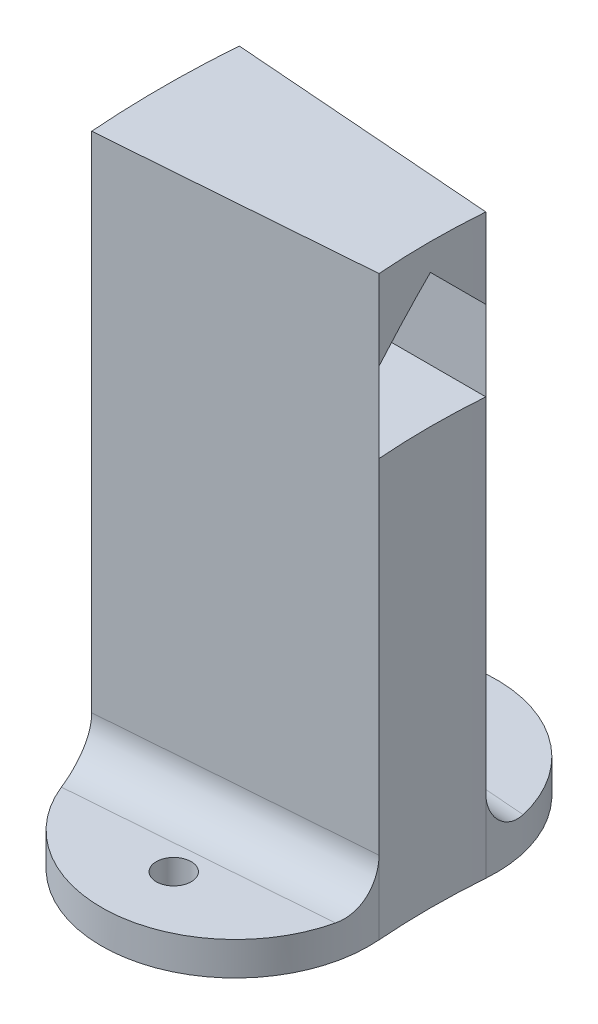
ISO-10303-21;
HEADER;
FILE_DESCRIPTION(('STEP AP214'),'2;1');
FILE_NAME('part.step','',(''),(''),'','','');
FILE_SCHEMA(('AUTOMOTIVE_DESIGN { 1 0 10303 214 1 1 1 1 }'));
ENDSEC;
DATA;
#1=APPLICATION_CONTEXT('core data for automotive mechanical design processes');
#2=APPLICATION_PROTOCOL_DEFINITION('international standard','automotive_design',2000,#1);
#3=PRODUCT_CONTEXT('',#1,'mechanical');
#4=PRODUCT('Part','Part','',(#3));
#5=PRODUCT_RELATED_PRODUCT_CATEGORY('part','',(#4));
#6=PRODUCT_DEFINITION_FORMATION('','',#4);
#7=PRODUCT_DEFINITION_CONTEXT('part definition',#1,'design');
#8=PRODUCT_DEFINITION('design','',#6,#7);
#9=PRODUCT_DEFINITION_SHAPE('','',#8);
#10=(LENGTH_UNIT() NAMED_UNIT(*) SI_UNIT(.MILLI.,.METRE.));
#11=(NAMED_UNIT(*) PLANE_ANGLE_UNIT() SI_UNIT($,.RADIAN.));
#12=(NAMED_UNIT(*) SI_UNIT($,.STERADIAN.) SOLID_ANGLE_UNIT());
#13=UNCERTAINTY_MEASURE_WITH_UNIT(LENGTH_MEASURE(1.E-05),#10,'distance_accuracy_value','');
#14=(GEOMETRIC_REPRESENTATION_CONTEXT(3) GLOBAL_UNCERTAINTY_ASSIGNED_CONTEXT((#13)) GLOBAL_UNIT_ASSIGNED_CONTEXT((#10,
#11,#12)) REPRESENTATION_CONTEXT('',''));
#15=CARTESIAN_POINT('',(0.,0.,0.));
#16=DIRECTION('',(0.,0.,1.));
#17=DIRECTION('',(1.,0.,0.));
#18=AXIS2_PLACEMENT_3D('',#15,#16,#17);
#19=CARTESIAN_POINT('',(0.,79.336162892,0.));
#20=DIRECTION('',(0.,1.,0.));
#21=DIRECTION('',(0.,0.,1.));
#22=AXIS2_PLACEMENT_3D('',#19,#20,#21);
#23=PLANE('',#22);
#24=CARTESIAN_POINT('',(0.,79.336162892,0.));
#25=DIRECTION('',(0.,1.,0.));
#26=DIRECTION('',(0.,0.,1.));
#27=AXIS2_PLACEMENT_3D('',#24,#25,#26);
#28=CIRCLE('',#27,133.35);
#29=CARTESIAN_POINT('',(-132.962389042917,79.336162892,-10.16));
#30=VERTEX_POINT('',#29);
#31=CARTESIAN_POINT('',(-132.962389042917,79.336162892,10.16));
#32=VERTEX_POINT('',#31);
#33=EDGE_CURVE('E11',#30,#32,#28,.T.);
#34=ORIENTED_EDGE('',*,*,#33,.F.);
#35=DIRECTION('',(1.,0.,0.));
#36=VECTOR('',#35,1.);
#37=CARTESIAN_POINT('',(-132.962389042917,79.336162892,-10.16));
#38=LINE('',#37,#36);
#39=CARTESIAN_POINT('',(-184.017828030508,79.336162892,-10.16));
#40=VERTEX_POINT('',#39);
#41=EDGE_CURVE('E25',#40,#30,#38,.T.);
#42=ORIENTED_EDGE('',*,*,#41,.F.);
#43=CARTESIAN_POINT('',(0.,79.336162892,0.));
#44=DIRECTION('',(0.,1.,0.));
#45=DIRECTION('',(0.,0.,1.));
#46=AXIS2_PLACEMENT_3D('',#43,#44,#45);
#47=CIRCLE('',#46,184.298091778145);
#48=CARTESIAN_POINT('',(-184.017828030508,79.336162892,10.16));
#49=VERTEX_POINT('',#48);
#50=EDGE_CURVE('E353',#40,#49,#47,.T.);
#51=ORIENTED_EDGE('',*,*,#50,.T.);
#52=DIRECTION('',(-1.,0.,0.));
#53=VECTOR('',#52,1.);
#54=CARTESIAN_POINT('',(-132.962389042917,79.336162892,10.16));
#55=LINE('',#54,#53);
#56=EDGE_CURVE('E349',#32,#49,#55,.T.);
#57=ORIENTED_EDGE('',*,*,#56,.F.);
#58=EDGE_LOOP('',(#34,#42,#51,#57));
#59=FACE_BOUND('',#58,.T.);
#60=ADVANCED_FACE('F17',(#59),#23,.T.);
#61=CARTESIAN_POINT('',(0.,79.336162892,0.));
#62=DIRECTION('',(0.0761904761904762,0.,-0.997093281161732));
#63=DIRECTION('',(-0.997093281161732,0.,-0.0761904761904762));
#64=AXIS2_PLACEMENT_3D('',#61,#62,#63);
#65=PLANE('',#64);
#66=DIRECTION('',(0.,-1.,0.));
#67=VECTOR('',#66,1.);
#68=CARTESIAN_POINT('',(-132.962389042917,79.336162892,-10.16));
#69=LINE('',#68,#67);
#70=CARTESIAN_POINT('',(-132.962389042917,13.97,-10.16));
#71=VERTEX_POINT('',#70);
#72=EDGE_CURVE('E346',#30,#71,#69,.T.);
#73=ORIENTED_EDGE('',*,*,#72,.T.);
#74=DIRECTION('',(0.997093281161732,0.,0.0761904761904762));
#75=VECTOR('',#74,1.);
#76=CARTESIAN_POINT('',(-183.762389042917,13.97,-14.041759373573));
#77=LINE('',#76,#75);
#78=CARTESIAN_POINT('',(-183.762389042917,13.97,-14.041759373573));
#79=VERTEX_POINT('',#78);
#80=EDGE_CURVE('E343',#71,#79,#77,.F.);
#81=ORIENTED_EDGE('',*,*,#80,.T.);
#82=DIRECTION('',(0.,-1.,0.));
#83=VECTOR('',#82,1.);
#84=CARTESIAN_POINT('',(-183.762389042917,79.336162892,-14.041759373573));
#85=LINE('',#84,#83);
#86=CARTESIAN_POINT('',(-183.762389042917,109.816162892,-14.041759373573));
#87=VERTEX_POINT('',#86);
#88=EDGE_CURVE('E339',#87,#79,#85,.T.);
#89=ORIENTED_EDGE('',*,*,#88,.F.);
#90=DIRECTION('',(-0.997093281161732,0.,-0.0761904761904762));
#91=VECTOR('',#90,1.);
#92=CARTESIAN_POINT('',(-132.962389042917,109.816162892,-10.16));
#93=LINE('',#92,#91);
#94=CARTESIAN_POINT('',(-132.962389042917,109.816162892,-10.16));
#95=VERTEX_POINT('',#94);
#96=EDGE_CURVE('E335',#95,#87,#93,.T.);
#97=ORIENTED_EDGE('',*,*,#96,.F.);
#98=DIRECTION('',(0.,-1.,0.));
#99=VECTOR('',#98,1.);
#100=CARTESIAN_POINT('',(-132.962389042917,109.816162892,-10.16));
#101=LINE('',#100,#99);
#102=CARTESIAN_POINT('',(-132.962389042917,94.576162892,-10.16));
#103=VERTEX_POINT('',#102);
#104=EDGE_CURVE('E332',#95,#103,#101,.T.);
#105=ORIENTED_EDGE('',*,*,#104,.T.);
#106=DIRECTION('',(0.,-1.,0.));
#107=VECTOR('',#106,1.);
#108=CARTESIAN_POINT('',(-132.962389042917,107.276162892,-10.16));
#109=LINE('',#108,#107);
#110=EDGE_CURVE('E329',#103,#30,#109,.T.);
#111=ORIENTED_EDGE('',*,*,#110,.T.);
#112=EDGE_LOOP('',(#73,#81,#89,#97,#105,#111));
#113=FACE_BOUND('',#112,.T.);
#114=ADVANCED_FACE('F380',(#113),#65,.T.);
#115=CARTESIAN_POINT('',(0.,79.336162892,0.));
#116=DIRECTION('',(0.,-1.,0.));
#117=DIRECTION('',(0.,0.,-1.));
#118=AXIS2_PLACEMENT_3D('',#115,#116,#117);
#119=CYLINDRICAL_SURFACE('',#118,184.298091778145);
#120=DIRECTION('',(0.,-1.,0.));
#121=VECTOR('',#120,1.);
#122=CARTESIAN_POINT('',(-183.762389042917,79.336162892,14.041759373573));
#123=LINE('',#122,#121);
#124=CARTESIAN_POINT('',(-183.762389042917,109.816162892,14.0417593735729));
#125=VERTEX_POINT('',#124);
#126=CARTESIAN_POINT('',(-183.762389042917,13.97,14.041759373573));
#127=VERTEX_POINT('',#126);
#128=EDGE_CURVE('E325',#125,#127,#123,.T.);
#129=ORIENTED_EDGE('',*,*,#128,.F.);
#130=CARTESIAN_POINT('',(0.,109.816162892,0.));
#131=DIRECTION('',(0.,1.,0.));
#132=DIRECTION('',(0.,0.,1.));
#133=AXIS2_PLACEMENT_3D('',#130,#131,#132);
#134=CIRCLE('',#133,184.298091778145);
#135=EDGE_CURVE('E321',#87,#125,#134,.T.);
#136=ORIENTED_EDGE('',*,*,#135,.F.);
#137=ORIENTED_EDGE('',*,*,#88,.T.);
#138=DIRECTION('',(0.,-1.,0.));
#139=VECTOR('',#138,1.);
#140=CARTESIAN_POINT('',(-183.762389042917,6.35,-14.041759373573));
#141=LINE('',#140,#139);
#142=CARTESIAN_POINT('',(-183.762389042917,0.,-14.041759373573));
#143=VERTEX_POINT('',#142);
#144=EDGE_CURVE('E318',#79,#143,#141,.T.);
#145=ORIENTED_EDGE('',*,*,#144,.T.);
#146=CARTESIAN_POINT('',(0.,0.,0.));
#147=DIRECTION('',(0.,1.,0.));
#148=DIRECTION('',(0.,0.,1.));
#149=AXIS2_PLACEMENT_3D('',#146,#147,#148);
#150=CIRCLE('',#149,184.298091778145);
#151=CARTESIAN_POINT('',(-183.762389042917,0.,14.041759373573));
#152=VERTEX_POINT('',#151);
#153=EDGE_CURVE('E315',#143,#152,#150,.T.);
#154=ORIENTED_EDGE('',*,*,#153,.T.);
#155=DIRECTION('',(0.,-1.,0.));
#156=VECTOR('',#155,1.);
#157=CARTESIAN_POINT('',(-183.762389042917,6.35,14.041759373573));
#158=LINE('',#157,#156);
#159=EDGE_CURVE('E311',#127,#152,#158,.T.);
#160=ORIENTED_EDGE('',*,*,#159,.F.);
#161=EDGE_LOOP('',(#129,#136,#137,#145,#154,#160));
#162=FACE_BOUND('',#161,.T.);
#163=CARTESIAN_POINT('',(0.,104.736162892,0.));
#164=DIRECTION('',(0.,-0.707106781186551,0.707106781186544));
#165=DIRECTION('',(0.,-0.707106781186544,-0.707106781186551));
#166=AXIS2_PLACEMENT_3D('',#163,#164,#165);
#167=ELLIPSE('',#166,260.636860912133,184.298091778145);
#168=CARTESIAN_POINT('',(-184.017828030508,94.576162892,-10.16));
#169=VERTEX_POINT('',#168);
#170=CARTESIAN_POINT('',(-184.298091778145,104.736162892,0.));
#171=VERTEX_POINT('',#170);
#172=EDGE_CURVE('E308',#169,#171,#167,.F.);
#173=ORIENTED_EDGE('',*,*,#172,.T.);
#174=CARTESIAN_POINT('',(0.,104.736162892,0.));
#175=DIRECTION('',(0.,-0.707106781186551,-0.707106781186544));
#176=DIRECTION('',(0.,-0.707106781186544,0.707106781186551));
#177=AXIS2_PLACEMENT_3D('',#174,#175,#176);
#178=ELLIPSE('',#177,260.636860912133,184.298091778145);
#179=CARTESIAN_POINT('',(-184.017828030508,94.5761628920001,10.16));
#180=VERTEX_POINT('',#179);
#181=EDGE_CURVE('E157',#171,#180,#178,.F.);
#182=ORIENTED_EDGE('',*,*,#181,.T.);
#183=DIRECTION('',(0.,-1.,0.));
#184=VECTOR('',#183,1.);
#185=CARTESIAN_POINT('',(-184.017828030508,107.276162892,10.16));
#186=LINE('',#185,#184);
#187=EDGE_CURVE('E302',#180,#49,#186,.T.);
#188=ORIENTED_EDGE('',*,*,#187,.T.);
#189=ORIENTED_EDGE('',*,*,#50,.F.);
#190=DIRECTION('',(0.,-1.,0.));
#191=VECTOR('',#190,1.);
#192=CARTESIAN_POINT('',(-184.017828030508,107.276162892,-10.16));
#193=LINE('',#192,#191);
#194=EDGE_CURVE('E298',#169,#40,#193,.T.);
#195=ORIENTED_EDGE('',*,*,#194,.F.);
#196=EDGE_LOOP('',(#173,#182,#188,#189,#195));
#197=FACE_BOUND('',#196,.T.);
#198=ADVANCED_FACE('F361',(#162,#197),#119,.T.);
#199=CARTESIAN_POINT('',(0.,79.336162892,0.));
#200=DIRECTION('',(-0.0761904761904762,0.,-0.997093281161732));
#201=DIRECTION('',(-0.997093281161732,0.,0.0761904761904762));
#202=AXIS2_PLACEMENT_3D('',#199,#200,#201);
#203=PLANE('',#202);
#204=ORIENTED_EDGE('',*,*,#128,.T.);
#205=DIRECTION('',(0.997093281161732,0.,-0.0761904761904762));
#206=VECTOR('',#205,1.);
#207=CARTESIAN_POINT('',(0.,13.97,0.));
#208=LINE('',#207,#206);
#209=CARTESIAN_POINT('',(-132.962389042917,13.97,10.16));
#210=VERTEX_POINT('',#209);
#211=EDGE_CURVE('E295',#127,#210,#208,.T.);
#212=ORIENTED_EDGE('',*,*,#211,.T.);
#213=DIRECTION('',(0.,-1.,0.));
#214=VECTOR('',#213,1.);
#215=CARTESIAN_POINT('',(-132.962389042917,79.336162892,10.16));
#216=LINE('',#215,#214);
#217=EDGE_CURVE('E291',#32,#210,#216,.T.);
#218=ORIENTED_EDGE('',*,*,#217,.F.);
#219=DIRECTION('',(0.,-1.,0.));
#220=VECTOR('',#219,1.);
#221=CARTESIAN_POINT('',(-132.962389042917,107.276162892,10.16));
#222=LINE('',#221,#220);
#223=CARTESIAN_POINT('',(-132.962389042917,94.5761628920001,10.16));
#224=VERTEX_POINT('',#223);
#225=EDGE_CURVE('E287',#224,#32,#222,.T.);
#226=ORIENTED_EDGE('',*,*,#225,.F.);
#227=DIRECTION('',(0.,-1.,0.));
#228=VECTOR('',#227,1.);
#229=CARTESIAN_POINT('',(-132.962389042917,109.816162892,10.16));
#230=LINE('',#229,#228);
#231=CARTESIAN_POINT('',(-132.962389042917,109.816162892,10.16));
#232=VERTEX_POINT('',#231);
#233=EDGE_CURVE('E147',#232,#224,#230,.T.);
#234=ORIENTED_EDGE('',*,*,#233,.F.);
#235=DIRECTION('',(0.997093281161732,0.,-0.0761904761904762));
#236=VECTOR('',#235,1.);
#237=CARTESIAN_POINT('',(-183.762389042917,109.816162892,14.041759373573));
#238=LINE('',#237,#236);
#239=EDGE_CURVE('E281',#125,#232,#238,.T.);
#240=ORIENTED_EDGE('',*,*,#239,.F.);
#241=EDGE_LOOP('',(#204,#212,#218,#226,#234,#240));
#242=FACE_BOUND('',#241,.T.);
#243=ADVANCED_FACE('F366',(#242),#203,.F.);
#244=CARTESIAN_POINT('',(0.,79.336162892,0.));
#245=DIRECTION('',(0.,-1.,0.));
#246=DIRECTION('',(0.,0.,-1.));
#247=AXIS2_PLACEMENT_3D('',#244,#245,#246);
#248=CYLINDRICAL_SURFACE('',#247,133.35);
#249=CARTESIAN_POINT('',(0.,0.,0.));
#250=DIRECTION('',(0.,1.,0.));
#251=DIRECTION('',(0.,0.,1.));
#252=AXIS2_PLACEMENT_3D('',#249,#250,#251);
#253=CIRCLE('',#252,133.35);
#254=CARTESIAN_POINT('',(-132.962389042917,0.,-10.16));
#255=VERTEX_POINT('',#254);
#256=CARTESIAN_POINT('',(-132.962389042917,0.,10.16));
#257=VERTEX_POINT('',#256);
#258=EDGE_CURVE('E277',#255,#257,#253,.T.);
#259=ORIENTED_EDGE('',*,*,#258,.F.);
#260=DIRECTION('',(0.,-1.,0.));
#261=VECTOR('',#260,1.);
#262=CARTESIAN_POINT('',(-132.962389042917,6.35,-10.16));
#263=LINE('',#262,#261);
#264=EDGE_CURVE('E273',#71,#255,#263,.T.);
#265=ORIENTED_EDGE('',*,*,#264,.F.);
#266=ORIENTED_EDGE('',*,*,#72,.F.);
#267=ORIENTED_EDGE('',*,*,#33,.T.);
#268=ORIENTED_EDGE('',*,*,#217,.T.);
#269=DIRECTION('',(0.,-1.,0.));
#270=VECTOR('',#269,1.);
#271=CARTESIAN_POINT('',(-132.962389042917,6.35,10.16));
#272=LINE('',#271,#270);
#273=EDGE_CURVE('E270',#210,#257,#272,.T.);
#274=ORIENTED_EDGE('',*,*,#273,.T.);
#275=EDGE_LOOP('',(#259,#265,#266,#267,#268,#274));
#276=FACE_BOUND('',#275,.T.);
#277=ADVANCED_FACE('F371',(#276),#248,.F.);
#278=CARTESIAN_POINT('',(0.,0.,0.));
#279=DIRECTION('',(0.,1.,0.));
#280=DIRECTION('',(0.,0.,1.));
#281=AXIS2_PLACEMENT_3D('',#278,#279,#280);
#282=PLANE('',#281);
#283=ORIENTED_EDGE('',*,*,#153,.F.);
#284=CARTESIAN_POINT('',(-158.362389042917,0.,-12.1008796867865));
#285=DIRECTION('',(0.,1.,0.));
#286=DIRECTION('',(0.,0.,1.));
#287=AXIS2_PLACEMENT_3D('',#284,#285,#286);
#288=CIRCLE('',#287,25.4740458890727);
#289=EDGE_CURVE('E266',#255,#143,#288,.T.);
#290=ORIENTED_EDGE('',*,*,#289,.F.);
#291=ORIENTED_EDGE('',*,*,#258,.T.);
#292=CARTESIAN_POINT('',(-158.362389042917,0.,12.1008796867865));
#293=DIRECTION('',(0.,1.,0.));
#294=DIRECTION('',(0.,0.,1.));
#295=AXIS2_PLACEMENT_3D('',#292,#293,#294);
#296=CIRCLE('',#295,25.4740458890727);
#297=EDGE_CURVE('E262',#152,#257,#296,.T.);
#298=ORIENTED_EDGE('',*,*,#297,.F.);
#299=EDGE_LOOP('',(#283,#290,#291,#298));
#300=FACE_BOUND('',#299,.T.);
#301=CARTESIAN_POINT('',(-157.391949199524,0.,24.8008796867865));
#302=DIRECTION('',(0.,1.,0.));
#303=DIRECTION('',(0.,0.,1.));
#304=AXIS2_PLACEMENT_3D('',#301,#302,#303);
#305=CIRCLE('',#304,3.325);
#306=CARTESIAN_POINT('',(-157.391949199524,0.,28.1258796867865));
#307=VERTEX_POINT('',#306);
#308=EDGE_CURVE('E258',#307,#307,#305,.T.);
#309=ORIENTED_EDGE('',*,*,#308,.T.);
#310=EDGE_LOOP('',(#309));
#311=FACE_BOUND('',#310,.T.);
#312=CARTESIAN_POINT('',(-157.391949199524,0.,-24.8008796867865));
#313=DIRECTION('',(0.,1.,0.));
#314=DIRECTION('',(0.,0.,1.));
#315=AXIS2_PLACEMENT_3D('',#312,#313,#314);
#316=CIRCLE('',#315,3.325);
#317=CARTESIAN_POINT('',(-157.391949199524,0.,-21.4758796867865));
#318=VERTEX_POINT('',#317);
#319=EDGE_CURVE('E254',#318,#318,#316,.T.);
#320=ORIENTED_EDGE('',*,*,#319,.T.);
#321=EDGE_LOOP('',(#320));
#322=FACE_BOUND('',#321,.T.);
#323=ADVANCED_FACE('F395',(#300,#311,#322),#282,.F.);
#324=CARTESIAN_POINT('',(-157.391949199524,6.35,24.8008796867865));
#325=DIRECTION('',(0.,-1.,0.));
#326=DIRECTION('',(0.,0.,-1.));
#327=AXIS2_PLACEMENT_3D('',#324,#325,#326);
#328=CYLINDRICAL_SURFACE('',#327,3.325);
#329=CARTESIAN_POINT('',(-157.391949199524,6.35,24.8008796867865));
#330=DIRECTION('',(0.,1.,0.));
#331=DIRECTION('',(0.,0.,1.));
#332=AXIS2_PLACEMENT_3D('',#329,#330,#331);
#333=CIRCLE('',#332,3.325);
#334=CARTESIAN_POINT('',(-157.391949199524,6.35,28.1258796867865));
#335=VERTEX_POINT('',#334);
#336=EDGE_CURVE('E250',#335,#335,#333,.T.);
#337=ORIENTED_EDGE('',*,*,#336,.T.);
#338=EDGE_LOOP('',(#337));
#339=FACE_BOUND('',#338,.T.);
#340=ORIENTED_EDGE('',*,*,#308,.F.);
#341=EDGE_LOOP('',(#340));
#342=FACE_BOUND('',#341,.T.);
#343=ADVANCED_FACE('F397',(#339,#342),#328,.F.);
#344=CARTESIAN_POINT('',(-158.362389042917,6.35,12.1008796867865));
#345=DIRECTION('',(0.,-1.,0.));
#346=DIRECTION('',(0.,0.,-1.));
#347=AXIS2_PLACEMENT_3D('',#344,#345,#346);
#348=CYLINDRICAL_SURFACE('',#347,25.4740458890727);
#349=ORIENTED_EDGE('',*,*,#297,.T.);
#350=ORIENTED_EDGE('',*,*,#273,.F.);
#351=CARTESIAN_POINT('',(-132.962389042917,13.97,10.16));
#352=CARTESIAN_POINT('',(-132.962411039116,13.7558693433996,10.159978649774));
#353=CARTESIAN_POINT('',(-132.961702059079,13.5417419702134,10.1689988250808));
#354=CARTESIAN_POINT('',(-132.958981105079,13.1150157717762,10.2049680908419));
#355=CARTESIAN_POINT('',(-132.956969188712,12.9024168793792,10.2319163887917));
#356=CARTESIAN_POINT('',(-132.951802841156,12.480376777311,10.3035663385194));
#357=CARTESIAN_POINT('',(-132.948649094578,12.2709337536777,10.3482573537765));
#358=CARTESIAN_POINT('',(-132.941506456313,11.8565637502955,10.4550895112339));
#359=CARTESIAN_POINT('',(-132.937517574879,11.651636715136,10.5172304391975));
#360=CARTESIAN_POINT('',(-132.929107361247,11.2476452763914,10.6585887455456));
#361=CARTESIAN_POINT('',(-132.924685799966,11.0485840518347,10.7378151969143));
#362=CARTESIAN_POINT('',(-132.915913121206,10.6578560063876,10.9127941257492));
#363=CARTESIAN_POINT('',(-132.911562004874,10.4661893057644,11.0085468718668));
#364=CARTESIAN_POINT('',(-132.903508463486,10.0916588160136,11.2159097580957));
#365=CARTESIAN_POINT('',(-132.899805935687,9.90879363597234,11.3275173815555));
#366=CARTESIAN_POINT('',(-132.893684063928,9.55315567007877,11.5658270294909));
#367=CARTESIAN_POINT('',(-132.891264707682,9.38038278761045,11.6925289094303));
#368=CARTESIAN_POINT('',(-132.888386062383,9.04680350909757,11.9596315995628));
#369=CARTESIAN_POINT('',(-132.887919543076,8.88595514109972,12.099979905324));
#370=CARTESIAN_POINT('',(-132.889603355912,8.57668857125106,12.3937465344285));
#371=CARTESIAN_POINT('',(-132.891753646526,8.42827017217641,12.5471646503178));
#372=CARTESIAN_POINT('',(-132.899334336773,8.14495250560871,12.8659032626741));
#373=CARTESIAN_POINT('',(-132.904764288107,8.01005139336697,13.0312221297002));
#374=CARTESIAN_POINT('',(-132.919528555052,7.75470661922786,13.3725040683047));
#375=CARTESIAN_POINT('',(-132.928862769641,7.63426258336128,13.5484668643737));
#376=CARTESIAN_POINT('',(-132.951819042473,7.41037233494515,13.9068963185552));
#377=CARTESIAN_POINT('',(-132.965373601346,7.30669509423829,14.0892230288502));
#378=CARTESIAN_POINT('',(-132.997261257868,7.11479509131073,14.4614294082033));
#379=CARTESIAN_POINT('',(-133.015594297293,7.02657214081227,14.6513089852112));
#380=CARTESIAN_POINT('',(-133.057391922093,6.86604685083718,15.0371649378856));
#381=CARTESIAN_POINT('',(-133.080856987495,6.79374600191792,15.2331418824026));
#382=CARTESIAN_POINT('',(-133.133132258179,6.66539114541395,15.6295683661411));
#383=CARTESIAN_POINT('',(-133.161941530839,6.6093343074423,15.8300171196231));
#384=CARTESIAN_POINT('',(-133.240244155429,6.49052405876577,16.3312800284997));
#385=CARTESIAN_POINT('',(-133.293020054473,6.43752670398556,16.6339787599002));
#386=CARTESIAN_POINT('',(-133.380981768279,6.3848388200989,17.0888900660618));
#387=CARTESIAN_POINT('',(-133.411744888806,6.37174403219144,17.2405682105368));
#388=CARTESIAN_POINT('',(-133.476141261806,6.35432567781629,17.5438306292275));
#389=CARTESIAN_POINT('',(-133.509774701124,6.3500026828091,17.6954148966843));
#390=CARTESIAN_POINT('',(-133.544807419528,6.35,17.8467178610673));
#391=B_SPLINE_CURVE_WITH_KNOTS('',3,(#351,#352,#353,#354,#355,#356,#357,#358,#359,#360,#361,
#362,#363,#364,#365,#366,#367,#368,#369,#370,#371,#372,#373,#374,#375,#376,#377,#378,#379,#380,
#381,#382,#383,#384,#385,#386,#387,#388,#389,#390),.UNSPECIFIED.,.F.,.F.,(4,2,2,2,2,2,2,2,2,2,2,
2,2,2,2,2,2,2,2,4),(0.,0.642196266837882,1.28436414756262,1.9261476371685,2.56792324779488,
3.21004050564856,3.85216820274111,4.49419408828082,5.13621382654784,5.77585441433811,
6.4154848511548,7.0550278762652,7.69455435439476,8.32433659052732,8.9541111535648,
9.58394464829773,10.2136683335818,11.1463923071962,11.6121250454154,12.0778881239908),.UNSPECIFIED.);
#392=CARTESIAN_POINT('',(-133.544807419528,6.35,17.8467178610673));
#393=VERTEX_POINT('',#392);
#394=EDGE_CURVE('E243',#210,#393,#391,.T.);
#395=ORIENTED_EDGE('',*,*,#394,.T.);
#396=CARTESIAN_POINT('',(-158.362389042917,6.35,12.1008796867865));
#397=DIRECTION('',(0.,1.,0.));
#398=DIRECTION('',(0.,0.,1.));
#399=AXIS2_PLACEMENT_3D('',#396,#397,#398);
#400=CIRCLE('',#399,25.4740458890727);
#401=CARTESIAN_POINT('',(-182.018827809163,6.35,21.5507431174105));
#402=VERTEX_POINT('',#401);
#403=EDGE_CURVE('E231',#402,#393,#400,.T.);
#404=ORIENTED_EDGE('',*,*,#403,.F.);
#405=CARTESIAN_POINT('',(-182.018827809163,6.35,21.5507431174105));
#406=CARTESIAN_POINT('',(-182.098021632824,6.34997557158433,21.3525589117556));
#407=CARTESIAN_POINT('',(-182.174689239072,6.35816310395469,21.1533375693788));
#408=CARTESIAN_POINT('',(-182.322601205103,6.3911887295775,20.7542151684386));
#409=CARTESIAN_POINT('',(-182.393844332228,6.41603059486179,20.554313966101));
#410=CARTESIAN_POINT('',(-182.530495207598,6.48258926335008,20.1553323547597));
#411=CARTESIAN_POINT('',(-182.59590338963,6.52430481083957,19.9562518857916));
#412=CARTESIAN_POINT('',(-182.720641674708,6.62462885268722,19.5604752561849));
#413=CARTESIAN_POINT('',(-182.77997238175,6.68323566613695,19.3637788603276));
#414=CARTESIAN_POINT('',(-182.892549635339,6.81732542147715,18.9739778272421));
#415=CARTESIAN_POINT('',(-182.945784236088,6.89284066948974,18.7808808426322));
#416=CARTESIAN_POINT('',(-183.046048888004,7.06034259370127,18.4002985370274));
#417=CARTESIAN_POINT('',(-183.093078921702,7.15232931627724,18.2128132318344));
#418=CARTESIAN_POINT('',(-183.181047232171,7.35218501130707,17.8451749634198));
#419=CARTESIAN_POINT('',(-183.221989315405,7.46004397505706,17.6650174701504));
#420=CARTESIAN_POINT('',(-183.298074782255,7.69098680906223,17.3134550774606));
#421=CARTESIAN_POINT('',(-183.333218320321,7.81407027364356,17.1420499449957));
#422=CARTESIAN_POINT('',(-183.39732527287,8.07162916433456,16.8132465525209));
#423=CARTESIAN_POINT('',(-183.426411605543,8.20577982748409,16.6556176603248));
#424=CARTESIAN_POINT('',(-183.4798088788,8.48693223440044,16.3513046673792));
#425=CARTESIAN_POINT('',(-183.504118294972,8.63393805896166,16.2046240696899));
#426=CARTESIAN_POINT('',(-183.548411916198,8.93977175499733,15.9233842202846));
#427=CARTESIAN_POINT('',(-183.568395328146,9.09860178709661,15.7888271938734));
#428=CARTESIAN_POINT('',(-183.604516770547,9.42695807907962,15.5328921839944));
#429=CARTESIAN_POINT('',(-183.620654738989,9.59648451139829,15.411514413073));
#430=CARTESIAN_POINT('',(-183.649706070083,9.946644769222,15.1818116087317));
#431=CARTESIAN_POINT('',(-183.662588796642,10.1273655327008,15.0736152147763));
#432=CARTESIAN_POINT('',(-183.685418672022,10.4971741163368,14.8724198042725));
#433=CARTESIAN_POINT('',(-183.695366758562,10.6862592415336,14.7794159374323));
#434=CARTESIAN_POINT('',(-183.712780417014,11.0715252335438,14.6092648298205));
#435=CARTESIAN_POINT('',(-183.720246319719,11.2677051509857,14.5321154766822));
#436=CARTESIAN_POINT('',(-183.73308596673,11.6657401931751,14.3942438333712));
#437=CARTESIAN_POINT('',(-183.738460058629,11.8675943690558,14.3335188144986));
#438=CARTESIAN_POINT('',(-183.749778435205,12.3814823536607,14.2018300866042));
#439=CARTESIAN_POINT('',(-183.754577772774,12.6964603583379,14.1418388947051));
#440=CARTESIAN_POINT('',(-183.759302815288,13.17230657666,14.0818185005091));
#441=CARTESIAN_POINT('',(-183.76046552317,13.3314387859326,14.0668061147888));
#442=CARTESIAN_POINT('',(-183.762006318574,13.6503625992855,14.0467769902117));
#443=CARTESIAN_POINT('',(-183.76238427017,13.8101543127954,14.0417619829861));
#444=CARTESIAN_POINT('',(-183.762389042917,13.97,14.041759373573));
#445=B_SPLINE_CURVE_WITH_KNOTS('',3,(#405,#406,#407,#408,#409,#410,#411,#412,#413,#414,#415,
#416,#417,#418,#419,#420,#421,#422,#423,#424,#425,#426,#427,#428,#429,#430,#431,#432,#433,#434,
#435,#436,#437,#438,#439,#440,#441,#442,#443,#444),.UNSPECIFIED.,.F.,.F.,(4,2,2,2,2,2,2,2,2,2,2,
2,2,2,2,2,2,2,2,4),(0.,0.640127575412716,1.28040018201378,1.92062514923705,2.56078642743947,
3.20218142903034,3.84357823655993,4.48457231213222,5.12554931137893,5.75187275495702,
6.37839574799144,7.00503350724405,7.63168137100568,8.26402385673032,8.89616406767483,
9.52822000111487,10.1601708616926,11.1192583684812,11.59852565129,12.077875940075),.UNSPECIFIED.);
#446=EDGE_CURVE('E221',#402,#127,#445,.T.);
#447=ORIENTED_EDGE('',*,*,#446,.T.);
#448=ORIENTED_EDGE('',*,*,#159,.T.);
#449=EDGE_LOOP('',(#349,#350,#395,#404,#447,#448));
#450=FACE_BOUND('',#449,.T.);
#451=ADVANCED_FACE('F233',(#450),#348,.T.);
#452=CARTESIAN_POINT('',(0.,6.35,0.));
#453=DIRECTION('',(0.,1.,0.));
#454=DIRECTION('',(0.,0.,1.));
#455=AXIS2_PLACEMENT_3D('',#452,#453,#454);
#456=PLANE('',#455);
#457=ORIENTED_EDGE('',*,*,#336,.F.);
#458=EDGE_LOOP('',(#457));
#459=FACE_BOUND('',#458,.T.);
#460=ORIENTED_EDGE('',*,*,#403,.T.);
#461=DIRECTION('',(0.997093281161732,0.,-0.0761904761904762));
#462=VECTOR('',#461,1.);
#463=CARTESIAN_POINT('',(0.580571428571429,6.35,7.5978508024524));
#464=LINE('',#463,#462);
#465=EDGE_CURVE('E217',#393,#402,#464,.F.);
#466=ORIENTED_EDGE('',*,*,#465,.T.);
#467=EDGE_LOOP('',(#460,#466));
#468=FACE_BOUND('',#467,.T.);
#469=ADVANCED_FACE('F241',(#459,#468),#456,.T.);
#470=CARTESIAN_POINT('',(-157.391949199524,6.35,-24.8008796867865));
#471=DIRECTION('',(0.,-1.,0.));
#472=DIRECTION('',(0.,0.,-1.));
#473=AXIS2_PLACEMENT_3D('',#470,#471,#472);
#474=CYLINDRICAL_SURFACE('',#473,3.325);
#475=CARTESIAN_POINT('',(-157.391949199524,6.35,-24.8008796867865));
#476=DIRECTION('',(0.,1.,0.));
#477=DIRECTION('',(0.,0.,1.));
#478=AXIS2_PLACEMENT_3D('',#475,#476,#477);
#479=CIRCLE('',#478,3.325);
#480=CARTESIAN_POINT('',(-157.391949199524,6.35,-21.4758796867865));
#481=VERTEX_POINT('',#480);
#482=EDGE_CURVE('E213',#481,#481,#479,.T.);
#483=ORIENTED_EDGE('',*,*,#482,.T.);
#484=EDGE_LOOP('',(#483));
#485=FACE_BOUND('',#484,.T.);
#486=ORIENTED_EDGE('',*,*,#319,.F.);
#487=EDGE_LOOP('',(#486));
#488=FACE_BOUND('',#487,.T.);
#489=ADVANCED_FACE('F412',(#485,#488),#474,.F.);
#490=CARTESIAN_POINT('',(-158.362389042917,6.35,-12.1008796867865));
#491=DIRECTION('',(0.,-1.,0.));
#492=DIRECTION('',(0.,0.,-1.));
#493=AXIS2_PLACEMENT_3D('',#490,#491,#492);
#494=CYLINDRICAL_SURFACE('',#493,25.4740458890727);
#495=ORIENTED_EDGE('',*,*,#289,.T.);
#496=ORIENTED_EDGE('',*,*,#144,.F.);
#497=CARTESIAN_POINT('',(-183.762389042917,13.97,-14.041759373573));
#498=CARTESIAN_POINT('',(-183.762370546004,13.7558693433996,-14.0417349291636));
#499=CARTESIAN_POINT('',(-183.761700787189,13.5417419702134,-14.0507581014654));
#500=CARTESIAN_POINT('',(-183.758925051818,13.1150157717762,-14.0867231812403));
#501=CARTESIAN_POINT('',(-183.756819138746,12.9024168793792,-14.1136642966587));
#502=CARTESIAN_POINT('',(-183.751039153357,12.4803767773111,-14.1852673567328));
#503=CARTESIAN_POINT('',(-183.747366020469,12.2709337536777,-14.2299186843387));
#504=CARTESIAN_POINT('',(-183.738193865984,11.8565637502955,-14.3365957612131));
#505=CARTESIAN_POINT('',(-183.732694866804,11.651636715136,-14.3986212971745));
#506=CARTESIAN_POINT('',(-183.719529736333,11.2476452763914,-14.5396162680302));
#507=CARTESIAN_POINT('',(-183.711862452934,11.0485840518347,-14.6185947053782));
#508=CARTESIAN_POINT('',(-183.693947328439,10.6578560063875,-14.7928750362913));
#509=CARTESIAN_POINT('',(-183.683699445391,10.4661893057644,-14.8881771952144));
#510=CARTESIAN_POINT('',(-183.660153178204,10.0916588160135,-15.0943562421994));
#511=CARTESIAN_POINT('',(-183.64685527799,9.90879363597232,-15.2052306584385));
#512=CARTESIAN_POINT('',(-183.616697777998,9.55315567007875,-15.4417036818623));
#513=CARTESIAN_POINT('',(-183.599838212324,9.38038278761045,-15.5673021480555));
#514=CARTESIAN_POINT('',(-183.562100381727,9.04680350909757,-15.8317411576903));
#515=CARTESIAN_POINT('',(-183.541237240534,8.8859551410997,-15.9705309048256));
#516=CARTESIAN_POINT('',(-183.494938655643,8.57668857125103,-16.2606310748328));
#517=CARTESIAN_POINT('',(-183.469503284512,8.42827017217639,-16.411941298969));
#518=CARTESIAN_POINT('',(-183.413582091039,8.14495250560866,-16.7258275681685));
#519=CARTESIAN_POINT('',(-183.383096959365,8.0100513933669,-16.8884020708221));
#520=CARTESIAN_POINT('',(-183.316650401915,7.75470661922782,-17.2234784803159));
#521=CARTESIAN_POINT('',(-183.280689117848,7.63426258336129,-17.395980130194));
#522=CARTESIAN_POINT('',(-183.203540303885,7.41037233494515,-17.7467602958124));
#523=CARTESIAN_POINT('',(-183.162440753086,7.30669509423823,-17.9249107442467));
#524=CARTESIAN_POINT('',(-183.074371009811,7.11479509131064,-18.2879508684603));
#525=CARTESIAN_POINT('',(-183.027400888867,7.02657214081221,-18.4728404621043));
#526=CARTESIAN_POINT('',(-182.927462342624,6.86604685083716,-18.8478659874061));
#527=CARTESIAN_POINT('',(-182.874493356439,6.79374600191791,-19.0380024083757));
#528=CARTESIAN_POINT('',(-182.762592743943,6.66539114541395,-19.4218837883062));
#529=CARTESIAN_POINT('',(-182.70366215881,6.6093343074423,-19.6156281123507));
#530=CARTESIAN_POINT('',(-182.550107730138,6.49052405876576,-20.0991742241834));
#531=CARTESIAN_POINT('',(-182.451953111031,6.43752670398557,-20.3903399643715));
#532=CARTESIAN_POINT('',(-182.295894305867,6.3848388200989,-20.8266050316185));
#533=CARTESIAN_POINT('',(-182.242442666947,6.37174403219145,-20.9718481085369));
#534=CARTESIAN_POINT('',(-182.13271684179,6.35432567781629,-21.2618053997701));
#535=CARTESIAN_POINT('',(-182.076442471903,6.3500026828091,-21.4065195790155));
#536=CARTESIAN_POINT('',(-182.018827809163,6.35,-21.5507431174105));
#537=B_SPLINE_CURVE_WITH_KNOTS('',3,(#497,#498,#499,#500,#501,#502,#503,#504,#505,#506,#507,
#508,#509,#510,#511,#512,#513,#514,#515,#516,#517,#518,#519,#520,#521,#522,#523,#524,#525,#526,
#527,#528,#529,#530,#531,#532,#533,#534,#535,#536),.UNSPECIFIED.,.F.,.F.,(4,2,2,2,2,2,2,2,2,2,2,
2,2,2,2,2,2,2,2,4),(0.,0.642196266837883,1.28436414756261,1.9261476371685,2.56792324779489,
3.21004050564857,3.85216820274114,4.49419408828084,5.13621382654785,5.77585441433814,
6.41548485115486,7.0550278762653,7.69455435439491,8.32433659052746,8.95411115356489,
9.58394464829772,10.2136683335817,11.1463923071961,11.6121250454154,12.0778881239908),.UNSPECIFIED.);
#538=CARTESIAN_POINT('',(-182.018827809163,6.35,-21.5507431174105));
#539=VERTEX_POINT('',#538);
#540=EDGE_CURVE('E206',#79,#539,#537,.T.);
#541=ORIENTED_EDGE('',*,*,#540,.T.);
#542=CARTESIAN_POINT('',(-158.362389042917,6.35,-12.1008796867865));
#543=DIRECTION('',(0.,1.,0.));
#544=DIRECTION('',(0.,0.,1.));
#545=AXIS2_PLACEMENT_3D('',#542,#543,#544);
#546=CIRCLE('',#545,25.4740458890727);
#547=CARTESIAN_POINT('',(-133.544807419528,6.35,-17.8467178610673));
#548=VERTEX_POINT('',#547);
#549=EDGE_CURVE('E192',#548,#539,#546,.T.);
#550=ORIENTED_EDGE('',*,*,#549,.F.);
#551=CARTESIAN_POINT('',(-133.544807419528,6.35,-17.8467178610673));
#552=CARTESIAN_POINT('',(-133.496644750919,6.34997557158433,-17.6388020164822));
#553=CARTESIAN_POINT('',(-133.4511365509,6.35816310395469,-17.4302449047904));
#554=CARTESIAN_POINT('',(-133.365583708292,6.39118872957751,-17.01328285406));
#555=CARTESIAN_POINT('',(-133.325540305895,6.41603059486181,-16.8048779602044));
#556=CARTESIAN_POINT('',(-133.251096421648,6.48258926335009,-16.3897660523698));
#557=CARTESIAN_POINT('',(-133.216695520157,6.52430481083959,-16.1830589132141));
#558=CARTESIAN_POINT('',(-133.153538962707,6.62462885268723,-15.7729247527761));
#559=CARTESIAN_POINT('',(-133.124782745504,6.68323566613696,-15.5694974072362));
#560=CARTESIAN_POINT('',(-133.072738109916,6.81732542147716,-15.1671171898709));
#561=CARTESIAN_POINT('',(-133.049460335917,6.89284066948975,-14.9681736968385));
#562=CARTESIAN_POINT('',(-133.008184677741,7.06034259370127,-14.576775930103));
#563=CARTESIAN_POINT('',(-132.990186808431,7.15232931627725,-14.3843216746729));
#564=CARTESIAN_POINT('',(-132.959098040026,7.35218501130705,-14.0075859469687));
#565=CARTESIAN_POINT('',(-132.946004066949,7.46004397505704,-13.8232994188943));
#566=CARTESIAN_POINT('',(-132.924217645831,7.69098680906222,-13.464258382139));
#567=CARTESIAN_POINT('',(-132.91552508054,7.81407027364357,-13.2895036196522));
#568=CARTESIAN_POINT('',(-132.902120145927,8.07162916433458,-12.9547773434263));
#569=CARTESIAN_POINT('',(-132.89732132729,8.20577982748409,-12.7945591991886));
#570=CARTESIAN_POINT('',(-132.890780709927,8.48693223440042,-12.4856661970156));
#571=CARTESIAN_POINT('',(-132.889039885669,8.63393805896165,-12.3369950330866));
#572=CARTESIAN_POINT('',(-132.887991539312,8.93977175499733,-12.0522904866798));
#573=CARTESIAN_POINT('',(-132.888684463005,9.09860178709661,-11.916259424174));
#574=CARTESIAN_POINT('',(-132.891868649352,9.42695807907962,-11.657807593381));
#575=CARTESIAN_POINT('',(-132.894359941004,9.59648451139831,-11.5353870445946));
#576=CARTESIAN_POINT('',(-132.900546485357,9.94664476922203,-11.3039370827679));
#577=CARTESIAN_POINT('',(-132.904252473241,10.1273655327008,-11.1950394704785));
#578=CARTESIAN_POINT('',(-132.912256885266,10.4971741163368,-10.9927112079796));
#579=CARTESIAN_POINT('',(-132.916555119517,10.6862592415336,-10.899275621315));
#580=CARTESIAN_POINT('',(-132.925196056283,11.0715252335439,-10.7284541673521));
#581=CARTESIAN_POINT('',(-132.929538752792,11.2677051509857,-10.6510661619513));
#582=CARTESIAN_POINT('',(-132.937796118814,11.6657401931752,-10.5128443746998));
#583=CARTESIAN_POINT('',(-132.941710859362,11.8675943690559,-10.4520078430165));
#584=CARTESIAN_POINT('',(-132.950532413954,12.3814823536608,-10.3201283264971));
#585=CARTESIAN_POINT('',(-132.954903739727,12.696460358338,-10.26010442911));
#586=CARTESIAN_POINT('',(-132.959352934932,13.1723065766601,-10.2000629567077));
#587=CARTESIAN_POINT('',(-132.96048467828,13.3314387859326,-10.1850482049074));
#588=CARTESIAN_POINT('',(-132.962004957083,13.6503625992855,-10.1650175126036));
#589=CARTESIAN_POINT('',(-132.962393363784,13.8101543127954,-10.1600033042796));
#590=CARTESIAN_POINT('',(-132.962389042917,13.97,-10.16));
#591=B_SPLINE_CURVE_WITH_KNOTS('',3,(#551,#552,#553,#554,#555,#556,#557,#558,#559,#560,#561,
#562,#563,#564,#565,#566,#567,#568,#569,#570,#571,#572,#573,#574,#575,#576,#577,#578,#579,#580,
#581,#582,#583,#584,#585,#586,#587,#588,#589,#590),.UNSPECIFIED.,.F.,.F.,(4,2,2,2,2,2,2,2,2,2,2,
2,2,2,2,2,2,2,2,4),(0.,0.640127575412735,1.2804001820138,1.92062514923705,2.56078642743946,
3.20218142903029,3.84357823655986,4.48457231213212,5.12554931137882,5.75187275495693,
6.37839574799136,7.00503350724397,7.6316813710056,8.26402385673027,8.89616406767481,
9.52822000111487,10.1601708616926,11.1192583684812,11.5985256512899,12.077875940075),.UNSPECIFIED.);
#592=EDGE_CURVE('E182',#548,#71,#591,.T.);
#593=ORIENTED_EDGE('',*,*,#592,.T.);
#594=ORIENTED_EDGE('',*,*,#264,.T.);
#595=EDGE_LOOP('',(#495,#496,#541,#550,#593,#594));
#596=FACE_BOUND('',#595,.T.);
#597=ADVANCED_FACE('F194',(#596),#494,.T.);
#598=CARTESIAN_POINT('',(0.,6.35,0.));
#599=DIRECTION('',(0.,1.,0.));
#600=DIRECTION('',(0.,0.,1.));
#601=AXIS2_PLACEMENT_3D('',#598,#599,#600);
#602=PLANE('',#601);
#603=ORIENTED_EDGE('',*,*,#482,.F.);
#604=EDGE_LOOP('',(#603));
#605=FACE_BOUND('',#604,.T.);
#606=ORIENTED_EDGE('',*,*,#549,.T.);
#607=DIRECTION('',(0.997093281161732,0.,0.0761904761904762));
#608=VECTOR('',#607,1.);
#609=CARTESIAN_POINT('',(-132.381817614346,6.35,-17.7578508024524));
#610=LINE('',#609,#608);
#611=EDGE_CURVE('E178',#539,#548,#610,.T.);
#612=ORIENTED_EDGE('',*,*,#611,.T.);
#613=EDGE_LOOP('',(#606,#612));
#614=FACE_BOUND('',#613,.T.);
#615=ADVANCED_FACE('F202',(#605,#614),#602,.T.);
#616=CARTESIAN_POINT('',(0.580571428571429,13.97,-7.5978508024524));
#617=DIRECTION('',(-0.997093281161732,0.,-0.0761904761904762));
#618=DIRECTION('',(-0.0761904761904762,0.,0.997093281161732));
#619=AXIS2_PLACEMENT_3D('',#616,#617,#618);
#620=CYLINDRICAL_SURFACE('',#619,7.62);
#621=ORIENTED_EDGE('',*,*,#540,.F.);
#622=ORIENTED_EDGE('',*,*,#80,.F.);
#623=ORIENTED_EDGE('',*,*,#592,.F.);
#624=ORIENTED_EDGE('',*,*,#611,.F.);
#625=EDGE_LOOP('',(#621,#622,#623,#624));
#626=FACE_BOUND('',#625,.T.);
#627=ADVANCED_FACE('F197',(#626),#620,.F.);
#628=CARTESIAN_POINT('',(0.580571428571429,13.97,7.5978508024524));
#629=DIRECTION('',(0.997093281161732,0.,-0.0761904761904762));
#630=DIRECTION('',(-0.0761904761904762,0.,-0.997093281161732));
#631=AXIS2_PLACEMENT_3D('',#628,#629,#630);
#632=CYLINDRICAL_SURFACE('',#631,7.62);
#633=ORIENTED_EDGE('',*,*,#446,.F.);
#634=ORIENTED_EDGE('',*,*,#465,.F.);
#635=ORIENTED_EDGE('',*,*,#394,.F.);
#636=ORIENTED_EDGE('',*,*,#211,.F.);
#637=EDGE_LOOP('',(#633,#634,#635,#636));
#638=FACE_BOUND('',#637,.T.);
#639=ADVANCED_FACE('F201',(#638),#632,.F.);
#640=CARTESIAN_POINT('',(-132.962389042917,107.276162892,10.16));
#641=DIRECTION('',(0.,0.,1.));
#642=DIRECTION('',(1.,0.,0.));
#643=AXIS2_PLACEMENT_3D('',#640,#641,#642);
#644=PLANE('',#643);
#645=ORIENTED_EDGE('',*,*,#187,.F.);
#646=DIRECTION('',(1.,0.,0.));
#647=VECTOR('',#646,1.);
#648=CARTESIAN_POINT('',(-132.962389042917,94.5761628920001,10.16));
#649=LINE('',#648,#647);
#650=EDGE_CURVE('E174',#180,#224,#649,.T.);
#651=ORIENTED_EDGE('',*,*,#650,.T.);
#652=ORIENTED_EDGE('',*,*,#225,.T.);
#653=ORIENTED_EDGE('',*,*,#56,.T.);
#654=EDGE_LOOP('',(#645,#651,#652,#653));
#655=FACE_BOUND('',#654,.T.);
#656=ADVANCED_FACE('F239',(#655),#644,.F.);
#657=CARTESIAN_POINT('',(-132.962389042917,107.276162892,-10.16));
#658=DIRECTION('',(0.,0.,-1.));
#659=DIRECTION('',(-1.,0.,0.));
#660=AXIS2_PLACEMENT_3D('',#657,#658,#659);
#661=PLANE('',#660);
#662=ORIENTED_EDGE('',*,*,#110,.F.);
#663=DIRECTION('',(-1.,0.,0.));
#664=VECTOR('',#663,1.);
#665=CARTESIAN_POINT('',(-184.017828030508,94.576162892,-10.16));
#666=LINE('',#665,#664);
#667=EDGE_CURVE('E151',#103,#169,#666,.T.);
#668=ORIENTED_EDGE('',*,*,#667,.T.);
#669=ORIENTED_EDGE('',*,*,#194,.T.);
#670=ORIENTED_EDGE('',*,*,#41,.T.);
#671=EDGE_LOOP('',(#662,#668,#669,#670));
#672=FACE_BOUND('',#671,.T.);
#673=ADVANCED_FACE('F359',(#672),#661,.F.);
#674=CARTESIAN_POINT('',(0.,109.816162892,0.));
#675=DIRECTION('',(0.,-1.,0.));
#676=DIRECTION('',(0.,0.,-1.));
#677=AXIS2_PLACEMENT_3D('',#674,#675,#676);
#678=CYLINDRICAL_SURFACE('',#677,133.35);
#679=ORIENTED_EDGE('',*,*,#233,.T.);
#680=CARTESIAN_POINT('',(0.,104.736162892,0.));
#681=DIRECTION('',(0.,-0.707106781186551,-0.707106781186544));
#682=DIRECTION('',(0.,-0.707106781186544,0.707106781186551));
#683=AXIS2_PLACEMENT_3D('',#680,#681,#682);
#684=ELLIPSE('',#683,188.585378542451,133.35);
#685=CARTESIAN_POINT('',(-133.35,104.736162892,0.));
#686=VERTEX_POINT('',#685);
#687=EDGE_CURVE('E139',#224,#686,#684,.T.);
#688=ORIENTED_EDGE('',*,*,#687,.T.);
#689=CARTESIAN_POINT('',(0.,104.736162892,0.));
#690=DIRECTION('',(0.,-0.707106781186551,0.707106781186544));
#691=DIRECTION('',(0.,-0.707106781186544,-0.707106781186551));
#692=AXIS2_PLACEMENT_3D('',#689,#690,#691);
#693=ELLIPSE('',#692,188.585378542451,133.35);
#694=EDGE_CURVE('E144',#686,#103,#693,.T.);
#695=ORIENTED_EDGE('',*,*,#694,.T.);
#696=ORIENTED_EDGE('',*,*,#104,.F.);
#697=CARTESIAN_POINT('',(0.,109.816162892,0.));
#698=DIRECTION('',(0.,-1.,0.));
#699=DIRECTION('',(0.,0.,1.));
#700=AXIS2_PLACEMENT_3D('',#697,#698,#699);
#701=CIRCLE('',#700,133.35);
#702=EDGE_CURVE('E161',#232,#95,#701,.T.);
#703=ORIENTED_EDGE('',*,*,#702,.F.);
#704=EDGE_LOOP('',(#679,#688,#695,#696,#703));
#705=FACE_BOUND('',#704,.T.);
#706=ADVANCED_FACE('F141',(#705),#678,.F.);
#707=CARTESIAN_POINT('',(0.,109.816162892,0.));
#708=DIRECTION('',(0.,1.,0.));
#709=DIRECTION('',(0.,0.,1.));
#710=AXIS2_PLACEMENT_3D('',#707,#708,#709);
#711=PLANE('',#710);
#712=ORIENTED_EDGE('',*,*,#702,.T.);
#713=ORIENTED_EDGE('',*,*,#96,.T.);
#714=ORIENTED_EDGE('',*,*,#135,.T.);
#715=ORIENTED_EDGE('',*,*,#239,.T.);
#716=EDGE_LOOP('',(#712,#713,#714,#715));
#717=FACE_BOUND('',#716,.T.);
#718=ADVANCED_FACE('F437',(#717),#711,.T.);
#719=CARTESIAN_POINT('',(0.,107.276162892,-2.5400000000001));
#720=DIRECTION('',(0.,-0.707106781186551,-0.707106781186544));
#721=DIRECTION('',(1.,0.,0.));
#722=AXIS2_PLACEMENT_3D('',#719,#720,#721);
#723=PLANE('',#722);
#724=ORIENTED_EDGE('',*,*,#650,.F.);
#725=ORIENTED_EDGE('',*,*,#181,.F.);
#726=DIRECTION('',(1.,0.,0.));
#727=VECTOR('',#726,1.);
#728=CARTESIAN_POINT('',(0.,104.736162892,0.));
#729=LINE('',#728,#727);
#730=EDGE_CURVE('E155',#686,#171,#729,.F.);
#731=ORIENTED_EDGE('',*,*,#730,.F.);
#732=ORIENTED_EDGE('',*,*,#687,.F.);
#733=EDGE_LOOP('',(#724,#725,#731,#732));
#734=FACE_BOUND('',#733,.T.);
#735=ADVANCED_FACE('F156',(#734),#723,.T.);
#736=CARTESIAN_POINT('',(0.,107.276162892,2.54000000000007));
#737=DIRECTION('',(0.,-0.707106781186551,0.707106781186544));
#738=DIRECTION('',(-1.,0.,0.));
#739=AXIS2_PLACEMENT_3D('',#736,#737,#738);
#740=PLANE('',#739);
#741=ORIENTED_EDGE('',*,*,#172,.F.);
#742=ORIENTED_EDGE('',*,*,#667,.F.);
#743=ORIENTED_EDGE('',*,*,#694,.F.);
#744=ORIENTED_EDGE('',*,*,#730,.T.);
#745=EDGE_LOOP('',(#741,#742,#743,#744));
#746=FACE_BOUND('',#745,.T.);
#747=ADVANCED_FACE('F163',(#746),#740,.T.);
#748=CLOSED_SHELL('',(#60,#114,#198,#243,#277,#323,#343,#451,#469,#489,#597,#615,#627,#639,#656,
#673,#706,#718,#735,#747));
#749=MANIFOLD_SOLID_BREP('B1',#748);
#750=ADVANCED_BREP_SHAPE_REPRESENTATION('',(#18,#749),#14);
#751=SHAPE_DEFINITION_REPRESENTATION(#9,#750);
ENDSEC;
END-ISO-10303-21;
